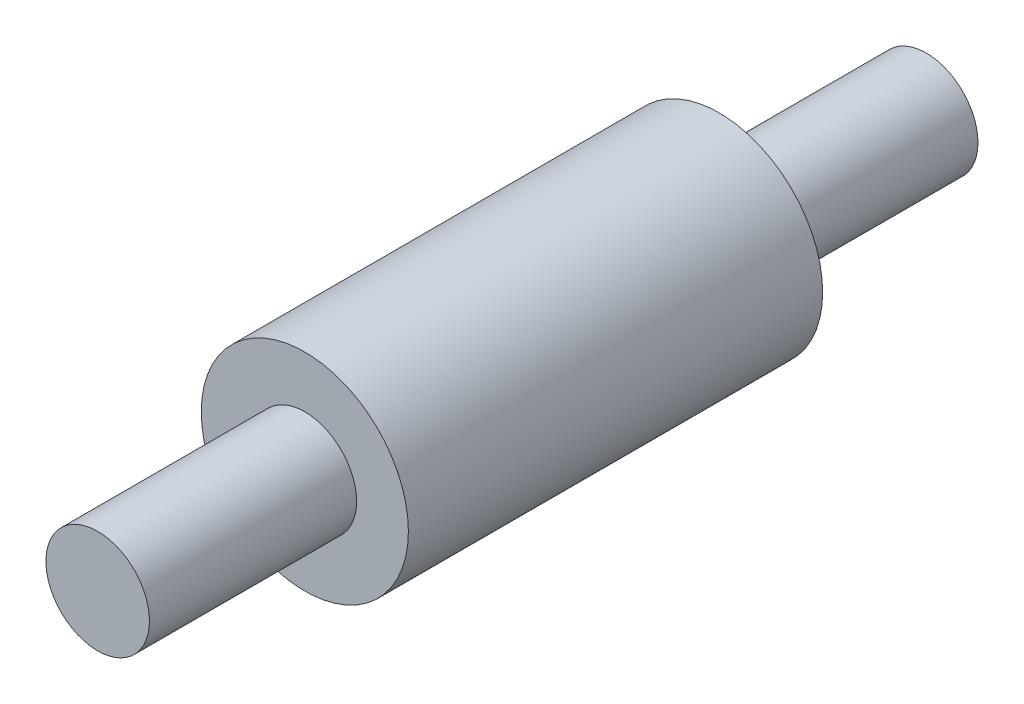
ISO-10303-21;
HEADER;
FILE_DESCRIPTION(('STEP AP214'),'2;1');
FILE_NAME('part.step','',(''),(''),'','','');
FILE_SCHEMA(('AUTOMOTIVE_DESIGN { 1 0 10303 214 1 1 1 1 }'));
ENDSEC;
DATA;
#1=APPLICATION_CONTEXT('core data for automotive mechanical design processes');
#2=APPLICATION_PROTOCOL_DEFINITION('international standard','automotive_design',2000,#1);
#3=PRODUCT_CONTEXT('',#1,'mechanical');
#4=PRODUCT('Part','Part','',(#3));
#5=PRODUCT_RELATED_PRODUCT_CATEGORY('part','',(#4));
#6=PRODUCT_DEFINITION_FORMATION('','',#4);
#7=PRODUCT_DEFINITION_CONTEXT('part definition',#1,'design');
#8=PRODUCT_DEFINITION('design','',#6,#7);
#9=PRODUCT_DEFINITION_SHAPE('','',#8);
#10=(LENGTH_UNIT() NAMED_UNIT(*) SI_UNIT(.MILLI.,.METRE.));
#11=(NAMED_UNIT(*) PLANE_ANGLE_UNIT() SI_UNIT($,.RADIAN.));
#12=(NAMED_UNIT(*) SI_UNIT($,.STERADIAN.) SOLID_ANGLE_UNIT());
#13=UNCERTAINTY_MEASURE_WITH_UNIT(LENGTH_MEASURE(1.E-05),#10,'distance_accuracy_value','');
#14=(GEOMETRIC_REPRESENTATION_CONTEXT(3) GLOBAL_UNCERTAINTY_ASSIGNED_CONTEXT((#13)) GLOBAL_UNIT_ASSIGNED_CONTEXT((#10,
#11,#12)) REPRESENTATION_CONTEXT('',''));
#15=CARTESIAN_POINT('',(0.,0.,0.));
#16=DIRECTION('',(0.,0.,1.));
#17=DIRECTION('',(1.,0.,0.));
#18=AXIS2_PLACEMENT_3D('',#15,#16,#17);
#19=CARTESIAN_POINT('',(0.,0.,10.));
#20=DIRECTION('',(0.,0.,-1.));
#21=DIRECTION('',(-1.,0.,0.));
#22=AXIS2_PLACEMENT_3D('',#19,#20,#21);
#23=CYLINDRICAL_SURFACE('',#22,2.5);
#24=CARTESIAN_POINT('',(0.,0.,10.));
#25=DIRECTION('',(0.,0.,1.));
#26=DIRECTION('',(1.,0.,0.));
#27=AXIS2_PLACEMENT_3D('',#24,#25,#26);
#28=CIRCLE('',#27,2.5);
#29=CARTESIAN_POINT('',(2.5,0.,10.));
#30=VERTEX_POINT('',#29);
#31=EDGE_CURVE('E38',#30,#30,#28,.T.);
#32=ORIENTED_EDGE('',*,*,#31,.F.);
#33=EDGE_LOOP('',(#32));
#34=FACE_BOUND('',#33,.T.);
#35=CARTESIAN_POINT('',(0.,0.,0.));
#36=DIRECTION('',(0.,0.,1.));
#37=DIRECTION('',(1.,0.,0.));
#38=AXIS2_PLACEMENT_3D('',#35,#36,#37);
#39=CIRCLE('',#38,2.5);
#40=CARTESIAN_POINT('',(2.5,0.,0.));
#41=VERTEX_POINT('',#40);
#42=EDGE_CURVE('E34',#41,#41,#39,.T.);
#43=ORIENTED_EDGE('',*,*,#42,.T.);
#44=EDGE_LOOP('',(#43));
#45=FACE_BOUND('',#44,.T.);
#46=ADVANCED_FACE('F31',(#34,#45),#23,.T.);
#47=CARTESIAN_POINT('',(0.,0.,0.));
#48=DIRECTION('',(0.,0.,1.));
#49=DIRECTION('',(1.,0.,0.));
#50=AXIS2_PLACEMENT_3D('',#47,#48,#49);
#51=PLANE('',#50);
#52=ORIENTED_EDGE('',*,*,#42,.F.);
#53=EDGE_LOOP('',(#52));
#54=FACE_BOUND('',#53,.T.);
#55=ADVANCED_FACE('F72',(#54),#51,.F.);
#56=CARTESIAN_POINT('',(0.,0.,30.));
#57=DIRECTION('',(0.,0.,-1.));
#58=DIRECTION('',(-1.,0.,0.));
#59=AXIS2_PLACEMENT_3D('',#56,#57,#58);
#60=CYLINDRICAL_SURFACE('',#59,5.);
#61=CARTESIAN_POINT('',(0.,0.,30.));
#62=DIRECTION('',(0.,0.,1.));
#63=DIRECTION('',(1.,0.,0.));
#64=AXIS2_PLACEMENT_3D('',#61,#62,#63);
#65=CIRCLE('',#64,5.);
#66=CARTESIAN_POINT('',(5.,0.,30.));
#67=VERTEX_POINT('',#66);
#68=EDGE_CURVE('E46',#67,#67,#65,.T.);
#69=ORIENTED_EDGE('',*,*,#68,.F.);
#70=EDGE_LOOP('',(#69));
#71=FACE_BOUND('',#70,.T.);
#72=CARTESIAN_POINT('',(0.,0.,10.));
#73=DIRECTION('',(0.,0.,1.));
#74=DIRECTION('',(1.,0.,0.));
#75=AXIS2_PLACEMENT_3D('',#72,#73,#74);
#76=CIRCLE('',#75,5.);
#77=CARTESIAN_POINT('',(5.,0.,10.));
#78=VERTEX_POINT('',#77);
#79=EDGE_CURVE('E49',#78,#78,#76,.T.);
#80=ORIENTED_EDGE('',*,*,#79,.T.);
#81=EDGE_LOOP('',(#80));
#82=FACE_BOUND('',#81,.T.);
#83=ADVANCED_FACE('F77',(#71,#82),#60,.T.);
#84=CARTESIAN_POINT('',(0.,0.,30.));
#85=DIRECTION('',(0.,0.,1.));
#86=DIRECTION('',(1.,0.,0.));
#87=AXIS2_PLACEMENT_3D('',#84,#85,#86);
#88=PLANE('',#87);
#89=CARTESIAN_POINT('',(0.,0.,30.));
#90=DIRECTION('',(0.,0.,1.));
#91=DIRECTION('',(1.,0.,0.));
#92=AXIS2_PLACEMENT_3D('',#89,#90,#91);
#93=CIRCLE('',#92,2.5);
#94=CARTESIAN_POINT('',(2.5,0.,30.));
#95=VERTEX_POINT('',#94);
#96=EDGE_CURVE('E10',#95,#95,#93,.T.);
#97=ORIENTED_EDGE('',*,*,#96,.F.);
#98=EDGE_LOOP('',(#97));
#99=FACE_BOUND('',#98,.T.);
#100=ORIENTED_EDGE('',*,*,#68,.T.);
#101=EDGE_LOOP('',(#100));
#102=FACE_BOUND('',#101,.T.);
#103=ADVANCED_FACE('F67',(#99,#102),#88,.T.);
#104=CARTESIAN_POINT('',(0.,0.,10.));
#105=DIRECTION('',(0.,0.,1.));
#106=DIRECTION('',(1.,0.,0.));
#107=AXIS2_PLACEMENT_3D('',#104,#105,#106);
#108=PLANE('',#107);
#109=ORIENTED_EDGE('',*,*,#31,.T.);
#110=EDGE_LOOP('',(#109));
#111=FACE_BOUND('',#110,.T.);
#112=ORIENTED_EDGE('',*,*,#79,.F.);
#113=EDGE_LOOP('',(#112));
#114=FACE_BOUND('',#113,.T.);
#115=ADVANCED_FACE('F60',(#111,#114),#108,.F.);
#116=CARTESIAN_POINT('',(0.,0.,40.));
#117=DIRECTION('',(0.,0.,-1.));
#118=DIRECTION('',(-1.,0.,0.));
#119=AXIS2_PLACEMENT_3D('',#116,#117,#118);
#120=CYLINDRICAL_SURFACE('',#119,2.5);
#121=CARTESIAN_POINT('',(0.,0.,40.));
#122=DIRECTION('',(0.,0.,1.));
#123=DIRECTION('',(1.,0.,0.));
#124=AXIS2_PLACEMENT_3D('',#121,#122,#123);
#125=CIRCLE('',#124,2.5);
#126=CARTESIAN_POINT('',(2.5,0.,40.));
#127=VERTEX_POINT('',#126);
#128=EDGE_CURVE('E45',#127,#127,#125,.T.);
#129=ORIENTED_EDGE('',*,*,#128,.F.);
#130=EDGE_LOOP('',(#129));
#131=FACE_BOUND('',#130,.T.);
#132=ORIENTED_EDGE('',*,*,#96,.T.);
#133=EDGE_LOOP('',(#132));
#134=FACE_BOUND('',#133,.T.);
#135=ADVANCED_FACE('F58',(#131,#134),#120,.T.);
#136=CARTESIAN_POINT('',(0.,0.,40.));
#137=DIRECTION('',(0.,0.,1.));
#138=DIRECTION('',(1.,0.,0.));
#139=AXIS2_PLACEMENT_3D('',#136,#137,#138);
#140=PLANE('',#139);
#141=ORIENTED_EDGE('',*,*,#128,.T.);
#142=EDGE_LOOP('',(#141));
#143=FACE_BOUND('',#142,.T.);
#144=ADVANCED_FACE('F56',(#143),#140,.T.);
#145=CLOSED_SHELL('',(#46,#55,#83,#103,#115,#135,#144));
#146=MANIFOLD_SOLID_BREP('B2',#145);
#147=ADVANCED_BREP_SHAPE_REPRESENTATION('',(#18,#146),#14);
#148=SHAPE_DEFINITION_REPRESENTATION(#9,#147);
ENDSEC;
END-ISO-10303-21;
